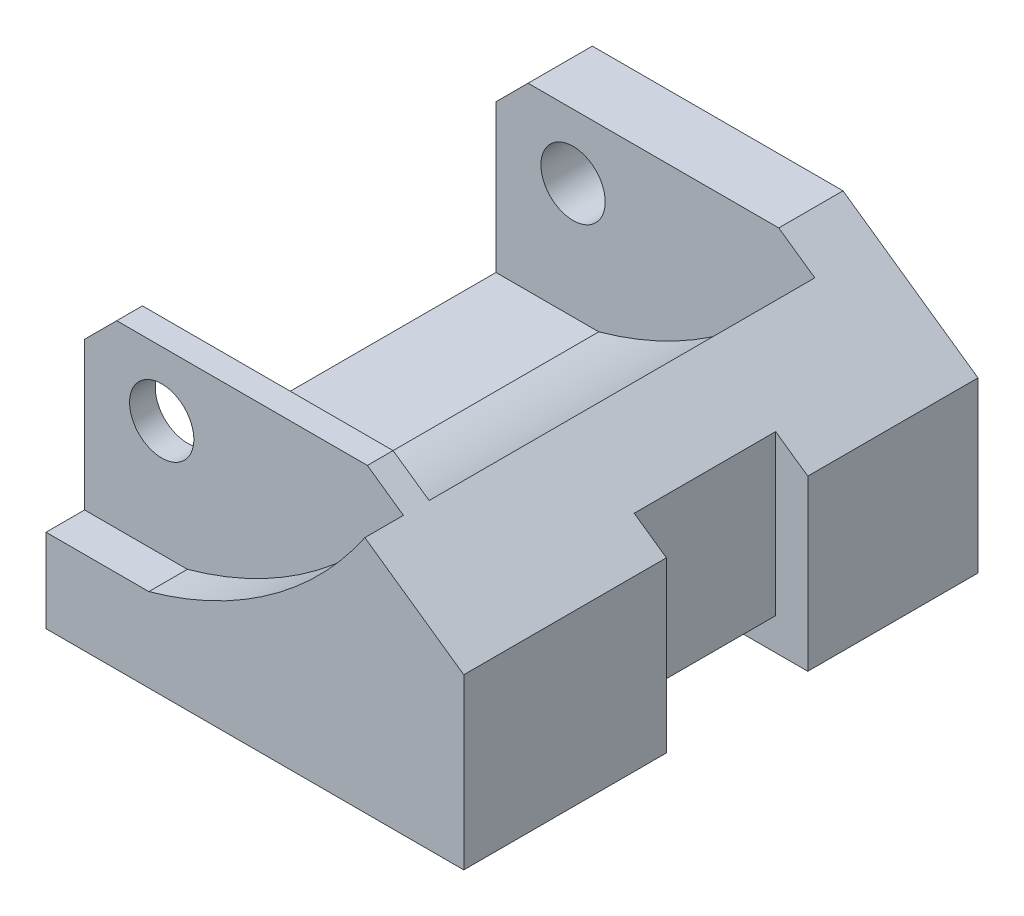
ISO-10303-21;
HEADER;
FILE_DESCRIPTION(('STEP AP214'),'2;1');
FILE_NAME('part.step','',(''),(''),'','','');
FILE_SCHEMA(('AUTOMOTIVE_DESIGN { 1 0 10303 214 1 1 1 1 }'));
ENDSEC;
DATA;
#1=APPLICATION_CONTEXT('core data for automotive mechanical design processes');
#2=APPLICATION_PROTOCOL_DEFINITION('international standard','automotive_design',2000,#1);
#3=PRODUCT_CONTEXT('',#1,'mechanical');
#4=PRODUCT('Part','Part','',(#3));
#5=PRODUCT_RELATED_PRODUCT_CATEGORY('part','',(#4));
#6=PRODUCT_DEFINITION_FORMATION('','',#4);
#7=PRODUCT_DEFINITION_CONTEXT('part definition',#1,'design');
#8=PRODUCT_DEFINITION('design','',#6,#7);
#9=PRODUCT_DEFINITION_SHAPE('','',#8);
#10=(LENGTH_UNIT() NAMED_UNIT(*) SI_UNIT(.MILLI.,.METRE.));
#11=(NAMED_UNIT(*) PLANE_ANGLE_UNIT() SI_UNIT($,.RADIAN.));
#12=(NAMED_UNIT(*) SI_UNIT($,.STERADIAN.) SOLID_ANGLE_UNIT());
#13=UNCERTAINTY_MEASURE_WITH_UNIT(LENGTH_MEASURE(1.E-05),#10,'distance_accuracy_value','');
#14=(GEOMETRIC_REPRESENTATION_CONTEXT(3) GLOBAL_UNCERTAINTY_ASSIGNED_CONTEXT((#13)) GLOBAL_UNIT_ASSIGNED_CONTEXT((#10,
#11,#12)) REPRESENTATION_CONTEXT('',''));
#15=CARTESIAN_POINT('',(0.,0.,0.));
#16=DIRECTION('',(0.,0.,1.));
#17=DIRECTION('',(1.,0.,0.));
#18=AXIS2_PLACEMENT_3D('',#15,#16,#17);
#19=CARTESIAN_POINT('',(0.,4.99999999999999,40.));
#20=DIRECTION('',(0.,-1.,0.));
#21=DIRECTION('',(1.,0.,0.));
#22=AXIS2_PLACEMENT_3D('',#19,#20,#21);
#23=PLANE('',#22);
#24=DIRECTION('',(0.,0.,-1.));
#25=VECTOR('',#24,1.);
#26=CARTESIAN_POINT('',(0.,5.,40.));
#27=LINE('',#26,#25);
#28=CARTESIAN_POINT('',(0.,5.,8.48118402941599));
#29=VERTEX_POINT('',#28);
#30=CARTESIAN_POINT('',(0.,5.,-13.518815970584));
#31=VERTEX_POINT('',#30);
#32=EDGE_CURVE('E200',#29,#31,#27,.T.);
#33=ORIENTED_EDGE('',*,*,#32,.T.);
#34=DIRECTION('',(1.,0.,0.));
#35=VECTOR('',#34,1.);
#36=CARTESIAN_POINT('',(0.,4.99999999999999,-13.518815970584));
#37=LINE('',#36,#35);
#38=CARTESIAN_POINT('',(60.,5.,-13.518815970584));
#39=VERTEX_POINT('',#38);
#40=EDGE_CURVE('E181',#31,#39,#37,.T.);
#41=ORIENTED_EDGE('',*,*,#40,.T.);
#42=DIRECTION('',(0.,0.,-1.));
#43=VECTOR('',#42,1.);
#44=CARTESIAN_POINT('',(60.,5.,40.));
#45=LINE('',#44,#43);
#46=CARTESIAN_POINT('',(60.,5.,8.48118402941599));
#47=VERTEX_POINT('',#46);
#48=EDGE_CURVE('E204',#47,#39,#45,.T.);
#49=ORIENTED_EDGE('',*,*,#48,.F.);
#50=DIRECTION('',(-1.,0.,0.));
#51=VECTOR('',#50,1.);
#52=CARTESIAN_POINT('',(0.,4.99999999999999,8.48118402941599));
#53=LINE('',#52,#51);
#54=EDGE_CURVE('E61',#47,#29,#53,.T.);
#55=ORIENTED_EDGE('',*,*,#54,.T.);
#56=EDGE_LOOP('',(#33,#41,#49,#55));
#57=FACE_BOUND('',#56,.T.);
#58=ADVANCED_FACE('F39',(#57),#23,.T.);
#59=CARTESIAN_POINT('',(60.,0.,40.));
#60=DIRECTION('',(1.,0.,0.));
#61=DIRECTION('',(0.,0.,-1.));
#62=AXIS2_PLACEMENT_3D('',#59,#60,#61);
#63=PLANE('',#62);
#64=ORIENTED_EDGE('',*,*,#48,.T.);
#65=DIRECTION('',(0.,1.,0.));
#66=VECTOR('',#65,1.);
#67=CARTESIAN_POINT('',(60.,0.,-13.518815970584));
#68=LINE('',#67,#66);
#69=CARTESIAN_POINT('',(60.,29.7966793886447,-13.518815970584));
#70=VERTEX_POINT('',#69);
#71=EDGE_CURVE('E187',#39,#70,#68,.T.);
#72=ORIENTED_EDGE('',*,*,#71,.T.);
#73=DIRECTION('',(0.,0.,-1.));
#74=VECTOR('',#73,1.);
#75=CARTESIAN_POINT('',(60.,29.7966793886447,40.));
#76=LINE('',#75,#74);
#77=CARTESIAN_POINT('',(60.,29.7966793886447,8.48118402941599));
#78=VERTEX_POINT('',#77);
#79=EDGE_CURVE('E210',#78,#70,#76,.T.);
#80=ORIENTED_EDGE('',*,*,#79,.F.);
#81=DIRECTION('',(0.,-1.,0.));
#82=VECTOR('',#81,1.);
#83=CARTESIAN_POINT('',(60.,0.,8.48118402941599));
#84=LINE('',#83,#82);
#85=EDGE_CURVE('E286',#78,#47,#84,.T.);
#86=ORIENTED_EDGE('',*,*,#85,.T.);
#87=EDGE_LOOP('',(#64,#72,#80,#86));
#88=FACE_BOUND('',#87,.T.);
#89=ADVANCED_FACE('F375',(#88),#63,.T.);
#90=CARTESIAN_POINT('',(0.,13.,40.));
#91=DIRECTION('',(0.,1.,0.));
#92=DIRECTION('',(0.,0.,1.));
#93=AXIS2_PLACEMENT_3D('',#90,#91,#92);
#94=PLANE('',#93);
#95=DIRECTION('',(0.,0.,-1.));
#96=VECTOR('',#95,1.);
#97=CARTESIAN_POINT('',(0.,13.,40.));
#98=LINE('',#97,#96);
#99=CARTESIAN_POINT('',(0.,13.,30.));
#100=VERTEX_POINT('',#99);
#101=CARTESIAN_POINT('',(0.,13.,-30.));
#102=VERTEX_POINT('',#101);
#103=EDGE_CURVE('E202',#100,#102,#98,.T.);
#104=ORIENTED_EDGE('',*,*,#103,.F.);
#105=DIRECTION('',(1.,0.,0.));
#106=VECTOR('',#105,1.);
#107=CARTESIAN_POINT('',(0.,13.,30.));
#108=LINE('',#107,#106);
#109=CARTESIAN_POINT('',(16.,13.,30.));
#110=VERTEX_POINT('',#109);
#111=EDGE_CURVE('E333',#100,#110,#108,.T.);
#112=ORIENTED_EDGE('',*,*,#111,.T.);
#113=DIRECTION('',(0.,0.,-1.));
#114=VECTOR('',#113,1.);
#115=CARTESIAN_POINT('',(16.,13.,40.));
#116=LINE('',#115,#114);
#117=CARTESIAN_POINT('',(16.,13.,-30.));
#118=VERTEX_POINT('',#117);
#119=EDGE_CURVE('E215',#110,#118,#116,.T.);
#120=ORIENTED_EDGE('',*,*,#119,.T.);
#121=DIRECTION('',(-1.,0.,0.));
#122=VECTOR('',#121,1.);
#123=CARTESIAN_POINT('',(0.,13.,-30.));
#124=LINE('',#123,#122);
#125=EDGE_CURVE('E236',#118,#102,#124,.T.);
#126=ORIENTED_EDGE('',*,*,#125,.T.);
#127=EDGE_LOOP('',(#104,#112,#120,#126));
#128=FACE_BOUND('',#127,.T.);
#129=ADVANCED_FACE('F393',(#128),#94,.T.);
#130=CARTESIAN_POINT('',(16.,13.,40.));
#131=VERTEX_POINT('',#130);
#132=CARTESIAN_POINT('',(16.,13.,34.));
#133=VERTEX_POINT('',#132);
#134=EDGE_CURVE('E214',#131,#133,#116,.T.);
#135=ORIENTED_EDGE('',*,*,#134,.T.);
#136=DIRECTION('',(-1.,0.,0.));
#137=VECTOR('',#136,1.);
#138=CARTESIAN_POINT('',(0.,13.,34.));
#139=LINE('',#138,#137);
#140=CARTESIAN_POINT('',(0.,13.,34.));
#141=VERTEX_POINT('',#140);
#142=EDGE_CURVE('E324',#133,#141,#139,.T.);
#143=ORIENTED_EDGE('',*,*,#142,.T.);
#144=CARTESIAN_POINT('',(0.,13.,40.));
#145=VERTEX_POINT('',#144);
#146=EDGE_CURVE('E205',#145,#141,#98,.T.);
#147=ORIENTED_EDGE('',*,*,#146,.F.);
#148=DIRECTION('',(1.,0.,0.));
#149=VECTOR('',#148,1.);
#150=CARTESIAN_POINT('',(0.,13.,40.));
#151=LINE('',#150,#149);
#152=EDGE_CURVE('E354',#145,#131,#151,.T.);
#153=ORIENTED_EDGE('',*,*,#152,.T.);
#154=EDGE_LOOP('',(#135,#143,#147,#153));
#155=FACE_BOUND('',#154,.T.);
#156=ADVANCED_FACE('F426',(#155),#94,.T.);
#157=CARTESIAN_POINT('',(0.,70.8273291792038,40.));
#158=DIRECTION('',(0.,0.,-1.));
#159=DIRECTION('',(-1.,0.,0.));
#160=AXIS2_PLACEMENT_3D('',#157,#158,#159);
#161=CYLINDRICAL_SURFACE('',#160,60.);
#162=ORIENTED_EDGE('',*,*,#119,.F.);
#163=CARTESIAN_POINT('',(0.,70.8273291792038,30.));
#164=DIRECTION('',(0.,0.,1.));
#165=DIRECTION('',(1.,0.,0.));
#166=AXIS2_PLACEMENT_3D('',#163,#164,#165);
#167=CIRCLE('',#166,60.);
#168=CARTESIAN_POINT('',(49.6060034384075,37.0746341331975,30.));
#169=VERTEX_POINT('',#168);
#170=EDGE_CURVE('E331',#110,#169,#167,.T.);
#171=ORIENTED_EDGE('',*,*,#170,.T.);
#172=DIRECTION('',(0.,0.,-1.));
#173=VECTOR('',#172,1.);
#174=CARTESIAN_POINT('',(49.6060034384075,37.0746341331975,40.));
#175=LINE('',#174,#173);
#176=CARTESIAN_POINT('',(49.6060034384075,37.0746341331975,-30.));
#177=VERTEX_POINT('',#176);
#178=EDGE_CURVE('E363',#169,#177,#175,.T.);
#179=ORIENTED_EDGE('',*,*,#178,.T.);
#180=CARTESIAN_POINT('',(0.,70.8273291792038,-30.));
#181=DIRECTION('',(0.,0.,-1.));
#182=DIRECTION('',(-1.,0.,0.));
#183=AXIS2_PLACEMENT_3D('',#180,#181,#182);
#184=CIRCLE('',#183,60.);
#185=EDGE_CURVE('E237',#177,#118,#184,.T.);
#186=ORIENTED_EDGE('',*,*,#185,.T.);
#187=EDGE_LOOP('',(#162,#171,#179,#186));
#188=FACE_BOUND('',#187,.T.);
#189=ADVANCED_FACE('F386',(#188),#161,.F.);
#190=CARTESIAN_POINT('',(49.6060034384075,37.0746341331975,40.));
#191=VERTEX_POINT('',#190);
#192=CARTESIAN_POINT('',(49.6060034384075,37.0746341331975,34.));
#193=VERTEX_POINT('',#192);
#194=EDGE_CURVE('E365',#191,#193,#175,.T.);
#195=ORIENTED_EDGE('',*,*,#194,.T.);
#196=CARTESIAN_POINT('',(0.,70.8273291792038,34.));
#197=DIRECTION('',(0.,0.,-1.));
#198=DIRECTION('',(-1.,0.,0.));
#199=AXIS2_PLACEMENT_3D('',#196,#197,#198);
#200=CIRCLE('',#199,60.);
#201=EDGE_CURVE('E318',#193,#133,#200,.T.);
#202=ORIENTED_EDGE('',*,*,#201,.T.);
#203=ORIENTED_EDGE('',*,*,#134,.F.);
#204=CARTESIAN_POINT('',(0.,70.8273291792038,40.));
#205=DIRECTION('',(0.,0.,1.));
#206=DIRECTION('',(1.,0.,0.));
#207=AXIS2_PLACEMENT_3D('',#204,#205,#206);
#208=CIRCLE('',#207,60.);
#209=EDGE_CURVE('E347',#131,#191,#208,.T.);
#210=ORIENTED_EDGE('',*,*,#209,.T.);
#211=EDGE_LOOP('',(#195,#202,#203,#210));
#212=FACE_BOUND('',#211,.T.);
#213=ADVANCED_FACE('F408',(#212),#161,.F.);
#214=CARTESIAN_POINT('',(0.,0.,40.));
#215=DIRECTION('',(-1.,0.,0.));
#216=DIRECTION('',(0.,0.,1.));
#217=AXIS2_PLACEMENT_3D('',#214,#215,#216);
#218=PLANE('',#217);
#219=DIRECTION('',(0.,1.,0.));
#220=VECTOR('',#219,1.);
#221=CARTESIAN_POINT('',(0.,0.,-40.));
#222=LINE('',#221,#220);
#223=CARTESIAN_POINT('',(0.,0.,-40.));
#224=VERTEX_POINT('',#223);
#225=CARTESIAN_POINT('',(0.,36.,-40.));
#226=VERTEX_POINT('',#225);
#227=EDGE_CURVE('E222',#224,#226,#222,.T.);
#228=ORIENTED_EDGE('',*,*,#227,.F.);
#229=DIRECTION('',(0.,0.,-1.));
#230=VECTOR('',#229,1.);
#231=CARTESIAN_POINT('',(0.,0.,40.));
#232=LINE('',#231,#230);
#233=CARTESIAN_POINT('',(0.,0.,-13.518815970584));
#234=VERTEX_POINT('',#233);
#235=EDGE_CURVE('E196',#234,#224,#232,.T.);
#236=ORIENTED_EDGE('',*,*,#235,.F.);
#237=DIRECTION('',(0.,-1.,0.));
#238=VECTOR('',#237,1.);
#239=CARTESIAN_POINT('',(0.,0.,-13.518815970584));
#240=LINE('',#239,#238);
#241=EDGE_CURVE('E183',#31,#234,#240,.T.);
#242=ORIENTED_EDGE('',*,*,#241,.F.);
#243=ORIENTED_EDGE('',*,*,#32,.F.);
#244=DIRECTION('',(0.,1.,0.));
#245=VECTOR('',#244,1.);
#246=CARTESIAN_POINT('',(0.,0.,8.48118402941599));
#247=LINE('',#246,#245);
#248=CARTESIAN_POINT('',(0.,0.,8.48118402941599));
#249=VERTEX_POINT('',#248);
#250=EDGE_CURVE('E302',#249,#29,#247,.T.);
#251=ORIENTED_EDGE('',*,*,#250,.F.);
#252=DIRECTION('',(0.,0.,-1.));
#253=VECTOR('',#252,1.);
#254=CARTESIAN_POINT('',(0.,0.,40.));
#255=LINE('',#254,#253);
#256=CARTESIAN_POINT('',(0.,0.,40.));
#257=VERTEX_POINT('',#256);
#258=EDGE_CURVE('E301',#257,#249,#255,.T.);
#259=ORIENTED_EDGE('',*,*,#258,.F.);
#260=DIRECTION('',(0.,1.,0.));
#261=VECTOR('',#260,1.);
#262=CARTESIAN_POINT('',(0.,0.,40.));
#263=LINE('',#262,#261);
#264=EDGE_CURVE('E358',#257,#145,#263,.T.);
#265=ORIENTED_EDGE('',*,*,#264,.T.);
#266=ORIENTED_EDGE('',*,*,#146,.T.);
#267=DIRECTION('',(0.,1.,0.));
#268=VECTOR('',#267,1.);
#269=CARTESIAN_POINT('',(0.,1.,34.));
#270=LINE('',#269,#268);
#271=CARTESIAN_POINT('',(0.,36.,34.));
#272=VERTEX_POINT('',#271);
#273=EDGE_CURVE('E306',#141,#272,#270,.T.);
#274=ORIENTED_EDGE('',*,*,#273,.T.);
#275=DIRECTION('',(0.,0.,-1.));
#276=VECTOR('',#275,1.);
#277=CARTESIAN_POINT('',(0.,36.,40.));
#278=LINE('',#277,#276);
#279=CARTESIAN_POINT('',(0.,36.,30.));
#280=VERTEX_POINT('',#279);
#281=EDGE_CURVE('E340',#272,#280,#278,.T.);
#282=ORIENTED_EDGE('',*,*,#281,.T.);
#283=DIRECTION('',(0.,1.,0.));
#284=VECTOR('',#283,1.);
#285=CARTESIAN_POINT('',(0.,1.,30.));
#286=LINE('',#285,#284);
#287=EDGE_CURVE('E307',#100,#280,#286,.T.);
#288=ORIENTED_EDGE('',*,*,#287,.F.);
#289=ORIENTED_EDGE('',*,*,#103,.T.);
#290=DIRECTION('',(0.,1.,0.));
#291=VECTOR('',#290,1.);
#292=CARTESIAN_POINT('',(0.,1.,-30.));
#293=LINE('',#292,#291);
#294=CARTESIAN_POINT('',(0.,36.,-30.));
#295=VERTEX_POINT('',#294);
#296=EDGE_CURVE('E217',#102,#295,#293,.T.);
#297=ORIENTED_EDGE('',*,*,#296,.T.);
#298=DIRECTION('',(0.,0.,-1.));
#299=VECTOR('',#298,1.);
#300=CARTESIAN_POINT('',(0.,36.,40.));
#301=LINE('',#300,#299);
#302=EDGE_CURVE('E43',#295,#226,#301,.T.);
#303=ORIENTED_EDGE('',*,*,#302,.T.);
#304=EDGE_LOOP('',(#228,#236,#242,#243,#251,#259,#265,#266,#274,#282,#288,#289,#297,#303));
#305=FACE_BOUND('',#304,.T.);
#306=ADVANCED_FACE('F193',(#305),#218,.T.);
#307=CARTESIAN_POINT('',(33.7392555729464,48.1846505954662,40.));
#308=DIRECTION('',(0.573576436351045,0.819152044288992,0.));
#309=DIRECTION('',(-0.819152044288992,0.573576436351045,0.));
#310=AXIS2_PLACEMENT_3D('',#307,#308,#309);
#311=PLANE('',#310);
#312=DIRECTION('',(-0.819152044288992,0.573576436351045,0.));
#313=VECTOR('',#312,1.);
#314=CARTESIAN_POINT('',(33.7392555729464,48.1846505954662,-30.));
#315=LINE('',#314,#313);
#316=CARTESIAN_POINT('',(44.,41.,-30.));
#317=VERTEX_POINT('',#316);
#318=EDGE_CURVE('E218',#177,#317,#315,.T.);
#319=ORIENTED_EDGE('',*,*,#318,.F.);
#320=ORIENTED_EDGE('',*,*,#178,.F.);
#321=DIRECTION('',(0.819152044288992,-0.573576436351045,0.));
#322=VECTOR('',#321,1.);
#323=CARTESIAN_POINT('',(33.7392555729464,48.1846505954662,30.));
#324=LINE('',#323,#322);
#325=CARTESIAN_POINT('',(44.,41.,30.));
#326=VERTEX_POINT('',#325);
#327=EDGE_CURVE('E326',#326,#169,#324,.T.);
#328=ORIENTED_EDGE('',*,*,#327,.F.);
#329=DIRECTION('',(0.,0.,-1.));
#330=VECTOR('',#329,1.);
#331=CARTESIAN_POINT('',(44.,41.,40.));
#332=LINE('',#331,#330);
#333=CARTESIAN_POINT('',(44.,41.,34.));
#334=VERTEX_POINT('',#333);
#335=EDGE_CURVE('E344',#334,#326,#332,.T.);
#336=ORIENTED_EDGE('',*,*,#335,.F.);
#337=DIRECTION('',(-0.819152044288992,0.573576436351045,0.));
#338=VECTOR('',#337,1.);
#339=CARTESIAN_POINT('',(33.7392555729464,48.1846505954662,34.));
#340=LINE('',#339,#338);
#341=EDGE_CURVE('E319',#193,#334,#340,.T.);
#342=ORIENTED_EDGE('',*,*,#341,.F.);
#343=ORIENTED_EDGE('',*,*,#194,.F.);
#344=DIRECTION('',(0.819152044288992,-0.573576436351045,0.));
#345=VECTOR('',#344,1.);
#346=CARTESIAN_POINT('',(33.7392555729464,48.1846505954662,40.));
#347=LINE('',#346,#345);
#348=CARTESIAN_POINT('',(65.,26.2956416975961,40.));
#349=VERTEX_POINT('',#348);
#350=EDGE_CURVE('E360',#191,#349,#347,.T.);
#351=ORIENTED_EDGE('',*,*,#350,.T.);
#352=DIRECTION('',(0.,0.,-1.));
#353=VECTOR('',#352,1.);
#354=CARTESIAN_POINT('',(65.,26.2956416975961,40.));
#355=LINE('',#354,#353);
#356=CARTESIAN_POINT('',(65.,26.2956416975961,8.48118402941599));
#357=VERTEX_POINT('',#356);
#358=EDGE_CURVE('E294',#349,#357,#355,.T.);
#359=ORIENTED_EDGE('',*,*,#358,.T.);
#360=DIRECTION('',(0.819152044288992,-0.573576436351045,0.));
#361=VECTOR('',#360,1.);
#362=CARTESIAN_POINT('',(33.7392555729464,48.1846505954662,8.48118402941599));
#363=LINE('',#362,#361);
#364=EDGE_CURVE('E289',#78,#357,#363,.T.);
#365=ORIENTED_EDGE('',*,*,#364,.F.);
#366=ORIENTED_EDGE('',*,*,#79,.T.);
#367=DIRECTION('',(-0.819152044288992,0.573576436351045,0.));
#368=VECTOR('',#367,1.);
#369=CARTESIAN_POINT('',(33.7392555729464,48.1846505954662,-13.518815970584));
#370=LINE('',#369,#368);
#371=CARTESIAN_POINT('',(65.,26.2956416975961,-13.518815970584));
#372=VERTEX_POINT('',#371);
#373=EDGE_CURVE('E57',#372,#70,#370,.T.);
#374=ORIENTED_EDGE('',*,*,#373,.F.);
#375=DIRECTION('',(0.,0.,-1.));
#376=VECTOR('',#375,1.);
#377=CARTESIAN_POINT('',(65.,26.2956416975961,40.));
#378=LINE('',#377,#376);
#379=CARTESIAN_POINT('',(65.,26.2956416975961,-40.));
#380=VERTEX_POINT('',#379);
#381=EDGE_CURVE('E280',#372,#380,#378,.T.);
#382=ORIENTED_EDGE('',*,*,#381,.T.);
#383=DIRECTION('',(0.819152044288992,-0.573576436351045,0.));
#384=VECTOR('',#383,1.);
#385=CARTESIAN_POINT('',(33.7392555729464,48.1846505954662,-40.));
#386=LINE('',#385,#384);
#387=CARTESIAN_POINT('',(44.,41.,-40.));
#388=VERTEX_POINT('',#387);
#389=EDGE_CURVE('E221',#388,#380,#386,.T.);
#390=ORIENTED_EDGE('',*,*,#389,.F.);
#391=DIRECTION('',(0.,0.,-1.));
#392=VECTOR('',#391,1.);
#393=CARTESIAN_POINT('',(44.,41.,40.));
#394=LINE('',#393,#392);
#395=EDGE_CURVE('E232',#317,#388,#394,.T.);
#396=ORIENTED_EDGE('',*,*,#395,.F.);
#397=EDGE_LOOP('',(#319,#320,#328,#336,#342,#343,#351,#359,#365,#366,#374,#382,#390,#396));
#398=FACE_BOUND('',#397,.T.);
#399=ADVANCED_FACE('F367',(#398),#311,.T.);
#400=CARTESIAN_POINT('',(-18.,18.,40.));
#401=DIRECTION('',(-0.707106781186549,0.707106781186546,0.));
#402=DIRECTION('',(-0.707106781186546,-0.707106781186549,0.));
#403=AXIS2_PLACEMENT_3D('',#400,#401,#402);
#404=PLANE('',#403);
#405=DIRECTION('',(-0.707106781186546,-0.707106781186549,0.));
#406=VECTOR('',#405,1.);
#407=CARTESIAN_POINT('',(-18.,18.,-30.));
#408=LINE('',#407,#406);
#409=CARTESIAN_POINT('',(4.99999999999998,41.,-30.));
#410=VERTEX_POINT('',#409);
#411=EDGE_CURVE('E11',#410,#295,#408,.T.);
#412=ORIENTED_EDGE('',*,*,#411,.F.);
#413=DIRECTION('',(0.,0.,-1.));
#414=VECTOR('',#413,1.);
#415=CARTESIAN_POINT('',(4.99999999999998,41.,40.));
#416=LINE('',#415,#414);
#417=CARTESIAN_POINT('',(4.99999999999998,41.,-40.));
#418=VERTEX_POINT('',#417);
#419=EDGE_CURVE('E245',#410,#418,#416,.T.);
#420=ORIENTED_EDGE('',*,*,#419,.T.);
#421=DIRECTION('',(0.707106781186546,0.707106781186549,0.));
#422=VECTOR('',#421,1.);
#423=CARTESIAN_POINT('',(-18.,18.,-40.));
#424=LINE('',#423,#422);
#425=EDGE_CURVE('E225',#226,#418,#424,.T.);
#426=ORIENTED_EDGE('',*,*,#425,.F.);
#427=ORIENTED_EDGE('',*,*,#302,.F.);
#428=EDGE_LOOP('',(#412,#420,#426,#427));
#429=FACE_BOUND('',#428,.T.);
#430=ADVANCED_FACE('F255',(#429),#404,.T.);
#431=CARTESIAN_POINT('',(12.,31.,40.));
#432=DIRECTION('',(0.,0.,-1.));
#433=DIRECTION('',(-1.,0.,0.));
#434=AXIS2_PLACEMENT_3D('',#431,#432,#433);
#435=CYLINDRICAL_SURFACE('',#434,5.);
#436=CARTESIAN_POINT('',(12.,31.,-30.));
#437=DIRECTION('',(0.,0.,-1.));
#438=DIRECTION('',(-1.,0.,0.));
#439=AXIS2_PLACEMENT_3D('',#436,#437,#438);
#440=CIRCLE('',#439,5.);
#441=CARTESIAN_POINT('',(7.,31.,-30.));
#442=VERTEX_POINT('',#441);
#443=EDGE_CURVE('E220',#442,#442,#440,.T.);
#444=ORIENTED_EDGE('',*,*,#443,.F.);
#445=EDGE_LOOP('',(#444));
#446=FACE_BOUND('',#445,.T.);
#447=CARTESIAN_POINT('',(12.,31.,-40.));
#448=DIRECTION('',(0.,0.,1.));
#449=DIRECTION('',(1.,0.,0.));
#450=AXIS2_PLACEMENT_3D('',#447,#448,#449);
#451=CIRCLE('',#450,5.);
#452=CARTESIAN_POINT('',(17.,31.,-40.));
#453=VERTEX_POINT('',#452);
#454=EDGE_CURVE('E228',#453,#453,#451,.T.);
#455=ORIENTED_EDGE('',*,*,#454,.F.);
#456=EDGE_LOOP('',(#455));
#457=FACE_BOUND('',#456,.T.);
#458=ADVANCED_FACE('F461',(#446,#457),#435,.F.);
#459=CARTESIAN_POINT('',(0.,41.,40.));
#460=DIRECTION('',(0.,1.,0.));
#461=DIRECTION('',(0.,0.,1.));
#462=AXIS2_PLACEMENT_3D('',#459,#460,#461);
#463=PLANE('',#462);
#464=DIRECTION('',(-1.,0.,0.));
#465=VECTOR('',#464,1.);
#466=CARTESIAN_POINT('',(0.,41.,-30.));
#467=LINE('',#466,#465);
#468=EDGE_CURVE('E48',#317,#410,#467,.T.);
#469=ORIENTED_EDGE('',*,*,#468,.F.);
#470=ORIENTED_EDGE('',*,*,#395,.T.);
#471=DIRECTION('',(1.,0.,0.));
#472=VECTOR('',#471,1.);
#473=CARTESIAN_POINT('',(0.,41.,-40.));
#474=LINE('',#473,#472);
#475=EDGE_CURVE('E230',#418,#388,#474,.T.);
#476=ORIENTED_EDGE('',*,*,#475,.F.);
#477=ORIENTED_EDGE('',*,*,#419,.F.);
#478=EDGE_LOOP('',(#469,#470,#476,#477));
#479=FACE_BOUND('',#478,.T.);
#480=ADVANCED_FACE('F41',(#479),#463,.T.);
#481=CARTESIAN_POINT('',(0.,0.,-40.));
#482=DIRECTION('',(0.,0.,1.));
#483=DIRECTION('',(1.,0.,0.));
#484=AXIS2_PLACEMENT_3D('',#481,#482,#483);
#485=PLANE('',#484);
#486=DIRECTION('',(1.,0.,0.));
#487=VECTOR('',#486,1.);
#488=CARTESIAN_POINT('',(0.,0.,-40.));
#489=LINE('',#488,#487);
#490=CARTESIAN_POINT('',(65.,0.,-40.));
#491=VERTEX_POINT('',#490);
#492=EDGE_CURVE('E261',#224,#491,#489,.T.);
#493=ORIENTED_EDGE('',*,*,#492,.F.);
#494=ORIENTED_EDGE('',*,*,#227,.T.);
#495=ORIENTED_EDGE('',*,*,#425,.T.);
#496=ORIENTED_EDGE('',*,*,#475,.T.);
#497=ORIENTED_EDGE('',*,*,#389,.T.);
#498=DIRECTION('',(0.,1.,0.));
#499=VECTOR('',#498,1.);
#500=CARTESIAN_POINT('',(65.,0.,-40.));
#501=LINE('',#500,#499);
#502=EDGE_CURVE('E277',#491,#380,#501,.T.);
#503=ORIENTED_EDGE('',*,*,#502,.F.);
#504=EDGE_LOOP('',(#493,#494,#495,#496,#497,#503));
#505=FACE_BOUND('',#504,.T.);
#506=ORIENTED_EDGE('',*,*,#454,.T.);
#507=EDGE_LOOP('',(#506));
#508=FACE_BOUND('',#507,.T.);
#509=ADVANCED_FACE('F258',(#505,#508),#485,.F.);
#510=CARTESIAN_POINT('',(0.,1.,-30.));
#511=DIRECTION('',(0.,0.,-1.));
#512=DIRECTION('',(-1.,0.,0.));
#513=AXIS2_PLACEMENT_3D('',#510,#511,#512);
#514=PLANE('',#513);
#515=ORIENTED_EDGE('',*,*,#443,.T.);
#516=EDGE_LOOP('',(#515));
#517=FACE_BOUND('',#516,.T.);
#518=ORIENTED_EDGE('',*,*,#185,.F.);
#519=ORIENTED_EDGE('',*,*,#318,.T.);
#520=ORIENTED_EDGE('',*,*,#468,.T.);
#521=ORIENTED_EDGE('',*,*,#411,.T.);
#522=ORIENTED_EDGE('',*,*,#296,.F.);
#523=ORIENTED_EDGE('',*,*,#125,.F.);
#524=EDGE_LOOP('',(#518,#519,#520,#521,#522,#523));
#525=FACE_BOUND('',#524,.T.);
#526=ADVANCED_FACE('F381',(#517,#525),#514,.F.);
#527=CARTESIAN_POINT('',(0.,0.,40.));
#528=DIRECTION('',(0.,0.,1.));
#529=DIRECTION('',(1.,0.,0.));
#530=AXIS2_PLACEMENT_3D('',#527,#528,#529);
#531=PLANE('',#530);
#532=ORIENTED_EDGE('',*,*,#264,.F.);
#533=DIRECTION('',(1.,0.,0.));
#534=VECTOR('',#533,1.);
#535=CARTESIAN_POINT('',(0.,0.,40.));
#536=LINE('',#535,#534);
#537=CARTESIAN_POINT('',(65.,0.,40.));
#538=VERTEX_POINT('',#537);
#539=EDGE_CURVE('E290',#257,#538,#536,.T.);
#540=ORIENTED_EDGE('',*,*,#539,.T.);
#541=DIRECTION('',(0.,1.,0.));
#542=VECTOR('',#541,1.);
#543=CARTESIAN_POINT('',(65.,0.,40.));
#544=LINE('',#543,#542);
#545=EDGE_CURVE('E292',#538,#349,#544,.T.);
#546=ORIENTED_EDGE('',*,*,#545,.T.);
#547=ORIENTED_EDGE('',*,*,#350,.F.);
#548=ORIENTED_EDGE('',*,*,#209,.F.);
#549=ORIENTED_EDGE('',*,*,#152,.F.);
#550=EDGE_LOOP('',(#532,#540,#546,#547,#548,#549));
#551=FACE_BOUND('',#550,.T.);
#552=ADVANCED_FACE('F413',(#551),#531,.T.);
#553=CARTESIAN_POINT('',(12.,31.,40.));
#554=DIRECTION('',(0.,0.,-1.));
#555=DIRECTION('',(-1.,0.,0.));
#556=AXIS2_PLACEMENT_3D('',#553,#554,#555);
#557=CYLINDRICAL_SURFACE('',#556,5.);
#558=CARTESIAN_POINT('',(12.,31.,30.));
#559=DIRECTION('',(0.,0.,1.));
#560=DIRECTION('',(1.,0.,0.));
#561=AXIS2_PLACEMENT_3D('',#558,#559,#560);
#562=CIRCLE('',#561,5.);
#563=CARTESIAN_POINT('',(17.,31.,30.));
#564=VERTEX_POINT('',#563);
#565=EDGE_CURVE('E327',#564,#564,#562,.T.);
#566=ORIENTED_EDGE('',*,*,#565,.F.);
#567=EDGE_LOOP('',(#566));
#568=FACE_BOUND('',#567,.T.);
#569=CARTESIAN_POINT('',(12.,31.,34.));
#570=DIRECTION('',(0.,0.,-1.));
#571=DIRECTION('',(-1.,0.,0.));
#572=AXIS2_PLACEMENT_3D('',#569,#570,#571);
#573=CIRCLE('',#572,5.);
#574=CARTESIAN_POINT('',(7.,31.,34.));
#575=VERTEX_POINT('',#574);
#576=EDGE_CURVE('E315',#575,#575,#573,.T.);
#577=ORIENTED_EDGE('',*,*,#576,.F.);
#578=EDGE_LOOP('',(#577));
#579=FACE_BOUND('',#578,.T.);
#580=ADVANCED_FACE('F431',(#568,#579),#557,.F.);
#581=CARTESIAN_POINT('',(0.,1.,34.));
#582=DIRECTION('',(0.,0.,-1.));
#583=DIRECTION('',(-1.,0.,0.));
#584=AXIS2_PLACEMENT_3D('',#581,#582,#583);
#585=PLANE('',#584);
#586=ORIENTED_EDGE('',*,*,#576,.T.);
#587=EDGE_LOOP('',(#586));
#588=FACE_BOUND('',#587,.T.);
#589=ORIENTED_EDGE('',*,*,#201,.F.);
#590=ORIENTED_EDGE('',*,*,#341,.T.);
#591=DIRECTION('',(-1.,0.,0.));
#592=VECTOR('',#591,1.);
#593=CARTESIAN_POINT('',(0.,41.,34.));
#594=LINE('',#593,#592);
#595=CARTESIAN_POINT('',(4.99999999999998,41.,34.));
#596=VERTEX_POINT('',#595);
#597=EDGE_CURVE('E309',#334,#596,#594,.T.);
#598=ORIENTED_EDGE('',*,*,#597,.T.);
#599=DIRECTION('',(-0.707106781186546,-0.707106781186549,0.));
#600=VECTOR('',#599,1.);
#601=CARTESIAN_POINT('',(-18.,18.,34.));
#602=LINE('',#601,#600);
#603=EDGE_CURVE('E317',#596,#272,#602,.T.);
#604=ORIENTED_EDGE('',*,*,#603,.T.);
#605=ORIENTED_EDGE('',*,*,#273,.F.);
#606=ORIENTED_EDGE('',*,*,#142,.F.);
#607=EDGE_LOOP('',(#589,#590,#598,#604,#605,#606));
#608=FACE_BOUND('',#607,.T.);
#609=ADVANCED_FACE('F429',(#588,#608),#585,.F.);
#610=CARTESIAN_POINT('',(0.,1.,30.));
#611=DIRECTION('',(0.,0.,1.));
#612=DIRECTION('',(1.,0.,0.));
#613=AXIS2_PLACEMENT_3D('',#610,#611,#612);
#614=PLANE('',#613);
#615=ORIENTED_EDGE('',*,*,#565,.T.);
#616=EDGE_LOOP('',(#615));
#617=FACE_BOUND('',#616,.T.);
#618=ORIENTED_EDGE('',*,*,#287,.T.);
#619=DIRECTION('',(0.707106781186546,0.707106781186549,0.));
#620=VECTOR('',#619,1.);
#621=CARTESIAN_POINT('',(-18.,18.,30.));
#622=LINE('',#621,#620);
#623=CARTESIAN_POINT('',(4.99999999999998,41.,30.));
#624=VERTEX_POINT('',#623);
#625=EDGE_CURVE('E330',#280,#624,#622,.T.);
#626=ORIENTED_EDGE('',*,*,#625,.T.);
#627=DIRECTION('',(1.,0.,0.));
#628=VECTOR('',#627,1.);
#629=CARTESIAN_POINT('',(0.,41.,30.));
#630=LINE('',#629,#628);
#631=EDGE_CURVE('E310',#624,#326,#630,.T.);
#632=ORIENTED_EDGE('',*,*,#631,.T.);
#633=ORIENTED_EDGE('',*,*,#327,.T.);
#634=ORIENTED_EDGE('',*,*,#170,.F.);
#635=ORIENTED_EDGE('',*,*,#111,.F.);
#636=EDGE_LOOP('',(#618,#626,#632,#633,#634,#635));
#637=FACE_BOUND('',#636,.T.);
#638=ADVANCED_FACE('F392',(#617,#637),#614,.F.);
#639=CARTESIAN_POINT('',(-18.,18.,40.));
#640=DIRECTION('',(-0.707106781186549,0.707106781186546,0.));
#641=DIRECTION('',(-0.707106781186546,-0.707106781186549,0.));
#642=AXIS2_PLACEMENT_3D('',#639,#640,#641);
#643=PLANE('',#642);
#644=ORIENTED_EDGE('',*,*,#625,.F.);
#645=ORIENTED_EDGE('',*,*,#281,.F.);
#646=ORIENTED_EDGE('',*,*,#603,.F.);
#647=DIRECTION('',(0.,0.,-1.));
#648=VECTOR('',#647,1.);
#649=CARTESIAN_POINT('',(4.99999999999998,41.,40.));
#650=LINE('',#649,#648);
#651=EDGE_CURVE('E338',#596,#624,#650,.T.);
#652=ORIENTED_EDGE('',*,*,#651,.T.);
#653=EDGE_LOOP('',(#644,#645,#646,#652));
#654=FACE_BOUND('',#653,.T.);
#655=ADVANCED_FACE('F400',(#654),#643,.T.);
#656=CARTESIAN_POINT('',(0.,41.,40.));
#657=DIRECTION('',(0.,1.,0.));
#658=DIRECTION('',(0.,0.,1.));
#659=AXIS2_PLACEMENT_3D('',#656,#657,#658);
#660=PLANE('',#659);
#661=ORIENTED_EDGE('',*,*,#631,.F.);
#662=ORIENTED_EDGE('',*,*,#651,.F.);
#663=ORIENTED_EDGE('',*,*,#597,.F.);
#664=ORIENTED_EDGE('',*,*,#335,.T.);
#665=EDGE_LOOP('',(#661,#662,#663,#664));
#666=FACE_BOUND('',#665,.T.);
#667=ADVANCED_FACE('F403',(#666),#660,.T.);
#668=CARTESIAN_POINT('',(65.,0.,40.));
#669=DIRECTION('',(-1.,0.,0.));
#670=DIRECTION('',(0.,0.,1.));
#671=AXIS2_PLACEMENT_3D('',#668,#669,#670);
#672=PLANE('',#671);
#673=DIRECTION('',(0.,-1.,0.));
#674=VECTOR('',#673,1.);
#675=CARTESIAN_POINT('',(65.,0.,8.48118402941599));
#676=LINE('',#675,#674);
#677=CARTESIAN_POINT('',(65.,0.,8.48118402941599));
#678=VERTEX_POINT('',#677);
#679=EDGE_CURVE('E278',#357,#678,#676,.T.);
#680=ORIENTED_EDGE('',*,*,#679,.F.);
#681=ORIENTED_EDGE('',*,*,#358,.F.);
#682=ORIENTED_EDGE('',*,*,#545,.F.);
#683=DIRECTION('',(0.,0.,-1.));
#684=VECTOR('',#683,1.);
#685=CARTESIAN_POINT('',(65.,0.,40.));
#686=LINE('',#685,#684);
#687=EDGE_CURVE('E296',#538,#678,#686,.T.);
#688=ORIENTED_EDGE('',*,*,#687,.T.);
#689=EDGE_LOOP('',(#680,#681,#682,#688));
#690=FACE_BOUND('',#689,.T.);
#691=ADVANCED_FACE('F420',(#690),#672,.F.);
#692=CARTESIAN_POINT('',(0.,0.,40.));
#693=DIRECTION('',(0.,1.,0.));
#694=DIRECTION('',(0.,0.,1.));
#695=AXIS2_PLACEMENT_3D('',#692,#693,#694);
#696=PLANE('',#695);
#697=ORIENTED_EDGE('',*,*,#258,.T.);
#698=DIRECTION('',(1.,0.,0.));
#699=VECTOR('',#698,1.);
#700=CARTESIAN_POINT('',(-15.,0.,8.48118402941599));
#701=LINE('',#700,#699);
#702=EDGE_CURVE('E285',#249,#678,#701,.T.);
#703=ORIENTED_EDGE('',*,*,#702,.T.);
#704=ORIENTED_EDGE('',*,*,#687,.F.);
#705=ORIENTED_EDGE('',*,*,#539,.F.);
#706=EDGE_LOOP('',(#697,#703,#704,#705));
#707=FACE_BOUND('',#706,.T.);
#708=ADVANCED_FACE('F425',(#707),#696,.F.);
#709=CARTESIAN_POINT('',(-15.,0.,8.48118402941599));
#710=DIRECTION('',(0.,0.,1.));
#711=DIRECTION('',(1.,0.,0.));
#712=AXIS2_PLACEMENT_3D('',#709,#710,#711);
#713=PLANE('',#712);
#714=ORIENTED_EDGE('',*,*,#364,.T.);
#715=ORIENTED_EDGE('',*,*,#679,.T.);
#716=ORIENTED_EDGE('',*,*,#702,.F.);
#717=ORIENTED_EDGE('',*,*,#250,.T.);
#718=ORIENTED_EDGE('',*,*,#54,.F.);
#719=ORIENTED_EDGE('',*,*,#85,.F.);
#720=EDGE_LOOP('',(#714,#715,#716,#717,#718,#719));
#721=FACE_BOUND('',#720,.T.);
#722=ADVANCED_FACE('F422',(#721),#713,.F.);
#723=CARTESIAN_POINT('',(0.,0.,40.));
#724=DIRECTION('',(0.,1.,0.));
#725=DIRECTION('',(0.,0.,1.));
#726=AXIS2_PLACEMENT_3D('',#723,#724,#725);
#727=PLANE('',#726);
#728=DIRECTION('',(1.,0.,0.));
#729=VECTOR('',#728,1.);
#730=CARTESIAN_POINT('',(-15.,0.,-13.518815970584));
#731=LINE('',#730,#729);
#732=CARTESIAN_POINT('',(65.,0.,-13.518815970584));
#733=VERTEX_POINT('',#732);
#734=EDGE_CURVE('E198',#234,#733,#731,.T.);
#735=ORIENTED_EDGE('',*,*,#734,.F.);
#736=ORIENTED_EDGE('',*,*,#235,.T.);
#737=ORIENTED_EDGE('',*,*,#492,.T.);
#738=DIRECTION('',(0.,0.,-1.));
#739=VECTOR('',#738,1.);
#740=CARTESIAN_POINT('',(65.,0.,40.));
#741=LINE('',#740,#739);
#742=EDGE_CURVE('E268',#733,#491,#741,.T.);
#743=ORIENTED_EDGE('',*,*,#742,.F.);
#744=EDGE_LOOP('',(#735,#736,#737,#743));
#745=FACE_BOUND('',#744,.T.);
#746=ADVANCED_FACE('F266',(#745),#727,.F.);
#747=CARTESIAN_POINT('',(65.,0.,40.));
#748=DIRECTION('',(-1.,0.,0.));
#749=DIRECTION('',(0.,0.,1.));
#750=AXIS2_PLACEMENT_3D('',#747,#748,#749);
#751=PLANE('',#750);
#752=DIRECTION('',(0.,1.,0.));
#753=VECTOR('',#752,1.);
#754=CARTESIAN_POINT('',(65.,0.,-13.518815970584));
#755=LINE('',#754,#753);
#756=EDGE_CURVE('E271',#733,#372,#755,.T.);
#757=ORIENTED_EDGE('',*,*,#756,.F.);
#758=ORIENTED_EDGE('',*,*,#742,.T.);
#759=ORIENTED_EDGE('',*,*,#502,.T.);
#760=ORIENTED_EDGE('',*,*,#381,.F.);
#761=EDGE_LOOP('',(#757,#758,#759,#760));
#762=FACE_BOUND('',#761,.T.);
#763=ADVANCED_FACE('F380',(#762),#751,.F.);
#764=CARTESIAN_POINT('',(-15.,0.,-13.518815970584));
#765=DIRECTION('',(0.,0.,-1.));
#766=DIRECTION('',(-1.,0.,0.));
#767=AXIS2_PLACEMENT_3D('',#764,#765,#766);
#768=PLANE('',#767);
#769=ORIENTED_EDGE('',*,*,#373,.T.);
#770=ORIENTED_EDGE('',*,*,#71,.F.);
#771=ORIENTED_EDGE('',*,*,#40,.F.);
#772=ORIENTED_EDGE('',*,*,#241,.T.);
#773=ORIENTED_EDGE('',*,*,#734,.T.);
#774=ORIENTED_EDGE('',*,*,#756,.T.);
#775=EDGE_LOOP('',(#769,#770,#771,#772,#773,#774));
#776=FACE_BOUND('',#775,.T.);
#777=ADVANCED_FACE('F182',(#776),#768,.F.);
#778=CLOSED_SHELL('',(#58,#89,#129,#156,#189,#213,#306,#399,#430,#458,#480,#509,#526,#552,#580,
#609,#638,#655,#667,#691,#708,#722,#746,#763,#777));
#779=MANIFOLD_SOLID_BREP('B2',#778);
#780=ADVANCED_BREP_SHAPE_REPRESENTATION('',(#18,#779),#14);
#781=SHAPE_DEFINITION_REPRESENTATION(#9,#780);
ENDSEC;
END-ISO-10303-21;
